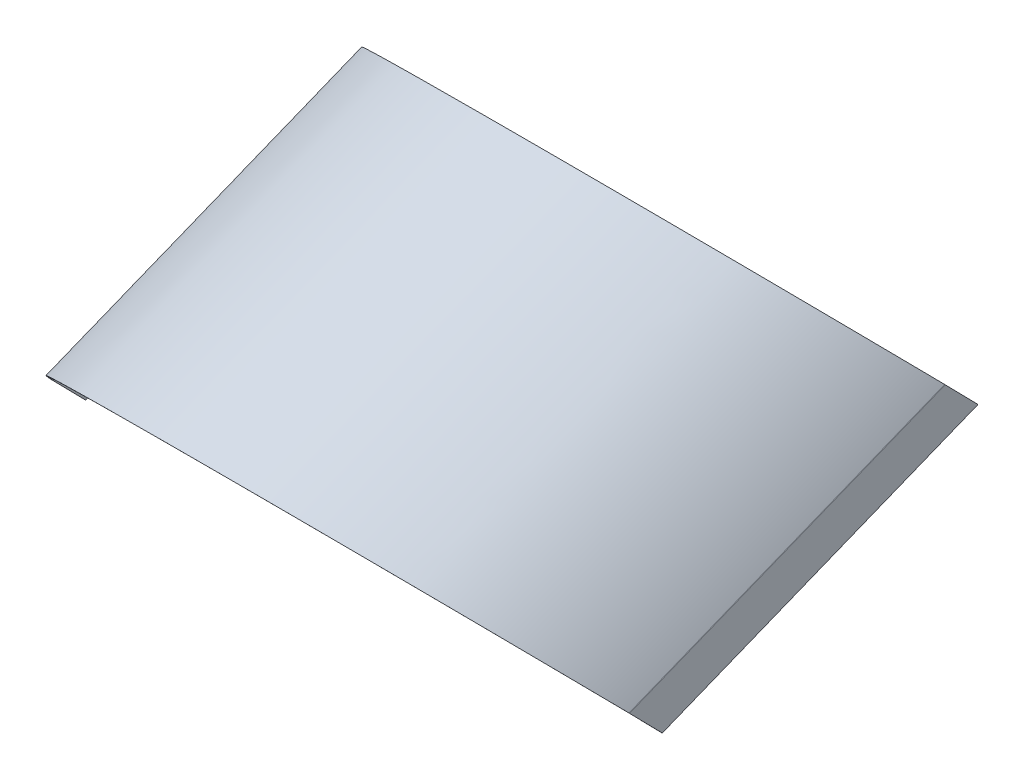
ISO-10303-21;
HEADER;
FILE_DESCRIPTION(('STEP AP214'),'2;1');
FILE_NAME('part.step','',(''),(''),'','','');
FILE_SCHEMA(('AUTOMOTIVE_DESIGN { 1 0 10303 214 1 1 1 1 }'));
ENDSEC;
DATA;
#1=APPLICATION_CONTEXT('core data for automotive mechanical design processes');
#2=APPLICATION_PROTOCOL_DEFINITION('international standard','automotive_design',2000,#1);
#3=PRODUCT_CONTEXT('',#1,'mechanical');
#4=PRODUCT('Part','Part','',(#3));
#5=PRODUCT_RELATED_PRODUCT_CATEGORY('part','',(#4));
#6=PRODUCT_DEFINITION_FORMATION('','',#4);
#7=PRODUCT_DEFINITION_CONTEXT('part definition',#1,'design');
#8=PRODUCT_DEFINITION('design','',#6,#7);
#9=PRODUCT_DEFINITION_SHAPE('','',#8);
#10=(LENGTH_UNIT() NAMED_UNIT(*) SI_UNIT(.MILLI.,.METRE.));
#11=(NAMED_UNIT(*) PLANE_ANGLE_UNIT() SI_UNIT($,.RADIAN.));
#12=(NAMED_UNIT(*) SI_UNIT($,.STERADIAN.) SOLID_ANGLE_UNIT());
#13=UNCERTAINTY_MEASURE_WITH_UNIT(LENGTH_MEASURE(1.E-05),#10,'distance_accuracy_value','');
#14=(GEOMETRIC_REPRESENTATION_CONTEXT(3) GLOBAL_UNCERTAINTY_ASSIGNED_CONTEXT((#13)) GLOBAL_UNIT_ASSIGNED_CONTEXT((#10,
#11,#12)) REPRESENTATION_CONTEXT('',''));
#15=CARTESIAN_POINT('',(0.,0.,0.));
#16=DIRECTION('',(0.,0.,1.));
#17=DIRECTION('',(1.,0.,0.));
#18=AXIS2_PLACEMENT_3D('',#15,#16,#17);
#19=CARTESIAN_POINT('',(158.177395808715,297.631991495394,466.725084626971));
#20=CARTESIAN_POINT('',(159.204825808715,297.631991495394,466.725084626971));
#21=CARTESIAN_POINT('',(159.204825808715,296.771188909988,465.881805086605));
#22=CARTESIAN_POINT('',(158.177395808715,296.771188909988,465.881805086605));
#23=CARTESIAN_POINT('',(157.149965808715,296.771188909988,465.881805086605));
#24=CARTESIAN_POINT('',(157.149965808715,297.631991495394,466.725084626971));
#25=CARTESIAN_POINT('',(158.177395808715,297.631991495394,466.725084626971));
#26=(BOUNDED_CURVE() B_SPLINE_CURVE(3,(#19,#20,#21,#22,#23,#24,#25),.UNSPECIFIED.,.T.,
.F.) B_SPLINE_CURVE_WITH_KNOTS((4,3,4),(0.,0.5,1.),
.UNSPECIFIED.) CURVE() GEOMETRIC_REPRESENTATION_ITEM() RATIONAL_B_SPLINE_CURVE((1.,
0.333333333333333,0.333333333333333,1.,0.333333333333333,0.333333333333333,1.)) REPRESENTATION_ITEM(''));
#27=DIRECTION('',(0.,0.372400072894438,-0.92807229551809));
#28=VECTOR('',#27,1.);
#29=SURFACE_OF_LINEAR_EXTRUSION('',#26,#28);
#30=CARTESIAN_POINT('',(158.691110808715,297.201590202691,466.303444856788));
#31=CARTESIAN_POINT('',(158.691110808715,297.278396914404,466.378688042216));
#32=CARTESIAN_POINT('',(158.667140500511,297.352531594915,466.451313590009));
#33=CARTESIAN_POINT('',(158.620867691773,297.418836096584,466.516268355061));
#34=(BOUNDED_CURVE() B_SPLINE_CURVE(3,(#30,#31,#32,#33),.UNSPECIFIED.,.F.,
.F.) B_SPLINE_CURVE_WITH_KNOTS((4,4),(0.,1.),
.UNSPECIFIED.) CURVE() GEOMETRIC_REPRESENTATION_ITEM() RATIONAL_B_SPLINE_CURVE((1.,
0.976807311567749,0.976807311567749,1.)) REPRESENTATION_ITEM(''));
#35=CARTESIAN_POINT('',(158.691110808715,297.201590202691,466.303444856788));
#36=VERTEX_POINT('',#35);
#37=CARTESIAN_POINT('',(158.620867691772,297.418836096583,466.516268355061));
#38=VERTEX_POINT('',#37);
#39=EDGE_CURVE('E76',#36,#38,#34,.T.);
#40=ORIENTED_EDGE('',*,*,#39,.F.);
#41=DIRECTION('',(0.,-0.372400072894438,0.92807229551809));
#42=VECTOR('',#41,1.);
#43=CARTESIAN_POINT('',(158.691110808715,297.201590202691,466.303444856788));
#44=LINE('',#43,#42);
#45=CARTESIAN_POINT('',(158.691110808715,349.012685162788,337.183057045927));
#46=VERTEX_POINT('',#45);
#47=EDGE_CURVE('E213',#46,#36,#44,.T.);
#48=ORIENTED_EDGE('',*,*,#47,.F.);
#49=CARTESIAN_POINT('',(158.620867691773,349.22993105668,337.395880544199));
#50=CARTESIAN_POINT('',(158.667140500511,349.163626555012,337.330925779147));
#51=CARTESIAN_POINT('',(158.691110808715,349.089491874501,337.258300231354));
#52=CARTESIAN_POINT('',(158.691110808715,349.012685162788,337.183057045926));
#53=(BOUNDED_CURVE() B_SPLINE_CURVE(3,(#49,#50,#51,#52),.UNSPECIFIED.,.F.,
.F.) B_SPLINE_CURVE_WITH_KNOTS((4,4),(0.,1.),
.UNSPECIFIED.) CURVE() GEOMETRIC_REPRESENTATION_ITEM() RATIONAL_B_SPLINE_CURVE((1.,
0.976807311567725,0.976807311567725,1.)) REPRESENTATION_ITEM(''));
#54=CARTESIAN_POINT('',(158.620867691772,349.22993105668,337.395880544199));
#55=VERTEX_POINT('',#54);
#56=EDGE_CURVE('E397',#55,#46,#53,.T.);
#57=ORIENTED_EDGE('',*,*,#56,.F.);
#58=DIRECTION('',(0.,0.372400072894438,-0.92807229551809));
#59=VECTOR('',#58,1.);
#60=CARTESIAN_POINT('',(158.620867691772,297.418836096583,466.516268355061));
#61=LINE('',#60,#59);
#62=EDGE_CURVE('E344',#38,#55,#61,.T.);
#63=ORIENTED_EDGE('',*,*,#62,.F.);
#64=EDGE_LOOP('',(#40,#48,#57,#63));
#65=FACE_BOUND('',#64,.T.);
#66=ADVANCED_FACE('F50',(#65),#29,.T.);
#67=CARTESIAN_POINT('',(157.663680808715,297.515279073689,466.610748077571));
#68=CARTESIAN_POINT('',(158.691110808715,297.515279073689,466.610748077571));
#69=CARTESIAN_POINT('',(158.691110808715,296.654476488284,465.767468537205));
#70=CARTESIAN_POINT('',(157.663680808715,296.654476488284,465.767468537205));
#71=CARTESIAN_POINT('',(156.636250808715,296.654476488284,465.767468537205));
#72=CARTESIAN_POINT('',(156.636250808715,297.515279073689,466.610748077571));
#73=CARTESIAN_POINT('',(157.663680808715,297.515279073689,466.610748077571));
#74=(BOUNDED_CURVE() B_SPLINE_CURVE(3,(#67,#68,#69,#70,#71,#72,#73),.UNSPECIFIED.,.T.,
.F.) B_SPLINE_CURVE_WITH_KNOTS((4,3,4),(0.,0.5,1.),
.UNSPECIFIED.) CURVE() GEOMETRIC_REPRESENTATION_ITEM() RATIONAL_B_SPLINE_CURVE((1.,
0.333333333333333,0.333333333333333,1.,0.333333333333333,0.333333333333333,1.)) REPRESENTATION_ITEM(''));
#75=DIRECTION('',(0.,0.372400072894438,-0.92807229551809));
#76=VECTOR('',#75,1.);
#77=SURFACE_OF_LINEAR_EXTRUSION('',#74,#76);
#78=CARTESIAN_POINT('',(158.106886893353,297.302504091341,466.402304478123));
#79=CARTESIAN_POINT('',(158.153332596331,297.236108002739,466.33725999054));
#80=CARTESIAN_POINT('',(158.177395808715,297.16183671237,466.264500613805));
#81=CARTESIAN_POINT('',(158.177395808715,297.084877780987,466.189108307388));
#82=(BOUNDED_CURVE() B_SPLINE_CURVE(3,(#78,#79,#80,#81),.UNSPECIFIED.,.F.,
.F.) B_SPLINE_CURVE_WITH_KNOTS((4,4),(0.,1.),
.UNSPECIFIED.) CURVE() GEOMETRIC_REPRESENTATION_ITEM() RATIONAL_B_SPLINE_CURVE((1.,
0.976717963163168,0.976717963163168,1.)) REPRESENTATION_ITEM(''));
#83=CARTESIAN_POINT('',(158.106886893353,297.302504091341,466.402304478123));
#84=VERTEX_POINT('',#83);
#85=CARTESIAN_POINT('',(158.177395808715,297.084877780987,466.189108307388));
#86=VERTEX_POINT('',#85);
#87=EDGE_CURVE('E188',#84,#86,#82,.T.);
#88=ORIENTED_EDGE('',*,*,#87,.F.);
#89=DIRECTION('',(0.,-0.372400072894438,0.92807229551809));
#90=VECTOR('',#89,1.);
#91=CARTESIAN_POINT('',(158.106886893353,297.302504091341,466.402304478123));
#92=LINE('',#91,#90);
#93=CARTESIAN_POINT('',(158.106886893353,349.113599051438,337.281916667262));
#94=VERTEX_POINT('',#93);
#95=EDGE_CURVE('E192',#94,#84,#92,.T.);
#96=ORIENTED_EDGE('',*,*,#95,.F.);
#97=CARTESIAN_POINT('',(158.177395808715,348.895972741084,337.068720496527));
#98=CARTESIAN_POINT('',(158.177395808715,348.972931672467,337.144112802944));
#99=CARTESIAN_POINT('',(158.153332596331,349.047202962836,337.216872179678));
#100=CARTESIAN_POINT('',(158.106886893353,349.113599051438,337.281916667262));
#101=(BOUNDED_CURVE() B_SPLINE_CURVE(3,(#97,#98,#99,#100),.UNSPECIFIED.,.F.,
.F.) B_SPLINE_CURVE_WITH_KNOTS((4,4),(0.,1.),
.UNSPECIFIED.) CURVE() GEOMETRIC_REPRESENTATION_ITEM() RATIONAL_B_SPLINE_CURVE((1.,
0.976717963163175,0.976717963163175,1.)) REPRESENTATION_ITEM(''));
#102=CARTESIAN_POINT('',(158.177395808715,348.895972741084,337.068720496527));
#103=VERTEX_POINT('',#102);
#104=EDGE_CURVE('E63',#103,#94,#101,.T.);
#105=ORIENTED_EDGE('',*,*,#104,.F.);
#106=DIRECTION('',(0.,0.372400072894438,-0.92807229551809));
#107=VECTOR('',#106,1.);
#108=CARTESIAN_POINT('',(158.177395808715,297.084877780987,466.189108307388));
#109=LINE('',#108,#107);
#110=EDGE_CURVE('E191',#86,#103,#109,.T.);
#111=ORIENTED_EDGE('',*,*,#110,.F.);
#112=EDGE_LOOP('',(#88,#96,#105,#111));
#113=FACE_BOUND('',#112,.T.);
#114=ADVANCED_FACE('F261',(#113),#77,.F.);
#115=CARTESIAN_POINT('',(-76.5903591912846,297.515279073689,466.610748077571));
#116=CARTESIAN_POINT('',(-75.5629291912846,297.515279073689,466.610748077571));
#117=CARTESIAN_POINT('',(-75.5629291912846,296.654476488284,465.767468537205));
#118=CARTESIAN_POINT('',(-76.5903591912846,296.654476488284,465.767468537205));
#119=CARTESIAN_POINT('',(-77.6177891912846,296.654476488284,465.767468537205));
#120=CARTESIAN_POINT('',(-77.6177891912846,297.515279073689,466.610748077571));
#121=CARTESIAN_POINT('',(-76.5903591912846,297.515279073689,466.610748077571));
#122=(BOUNDED_CURVE() B_SPLINE_CURVE(3,(#115,#116,#117,#118,#119,#120,#121),.UNSPECIFIED.,.T.,
.F.) B_SPLINE_CURVE_WITH_KNOTS((4,3,4),(0.,0.5,1.),
.UNSPECIFIED.) CURVE() GEOMETRIC_REPRESENTATION_ITEM() RATIONAL_B_SPLINE_CURVE((1.,
0.333333333333333,0.333333333333333,1.,0.333333333333333,0.333333333333333,1.)) REPRESENTATION_ITEM(''));
#123=DIRECTION('',(0.,0.372400072894438,-0.92807229551809));
#124=VECTOR('',#123,1.);
#125=SURFACE_OF_LINEAR_EXTRUSION('',#122,#124);
#126=CARTESIAN_POINT('',(-77.1040741912847,297.084877780987,466.189108307388));
#127=CARTESIAN_POINT('',(-77.1040741912847,297.16183671237,466.264500613805));
#128=CARTESIAN_POINT('',(-77.0800109789,297.236108002739,466.33725999054));
#129=CARTESIAN_POINT('',(-77.0335652759221,297.302504091341,466.402304478123));
#130=(BOUNDED_CURVE() B_SPLINE_CURVE(3,(#126,#127,#128,#129),.UNSPECIFIED.,.F.,
.F.) B_SPLINE_CURVE_WITH_KNOTS((4,4),(0.,1.),
.UNSPECIFIED.) CURVE() GEOMETRIC_REPRESENTATION_ITEM() RATIONAL_B_SPLINE_CURVE((1.,
0.976717963163193,0.976717963163193,1.)) REPRESENTATION_ITEM(''));
#131=CARTESIAN_POINT('',(-77.1040741912847,297.084877780987,466.189108307388));
#132=VERTEX_POINT('',#131);
#133=CARTESIAN_POINT('',(-77.0335652759221,297.302504091341,466.402304478123));
#134=VERTEX_POINT('',#133);
#135=EDGE_CURVE('E334',#132,#134,#130,.T.);
#136=ORIENTED_EDGE('',*,*,#135,.F.);
#137=DIRECTION('',(0.,-0.372400072894438,0.92807229551809));
#138=VECTOR('',#137,1.);
#139=CARTESIAN_POINT('',(-77.1040741912847,297.084877780987,466.189108307388));
#140=LINE('',#139,#138);
#141=CARTESIAN_POINT('',(-77.1040741912847,348.895972741084,337.068720496527));
#142=VERTEX_POINT('',#141);
#143=EDGE_CURVE('E214',#142,#132,#140,.T.);
#144=ORIENTED_EDGE('',*,*,#143,.F.);
#145=CARTESIAN_POINT('',(-77.0335652759221,349.113599051438,337.281916667262));
#146=CARTESIAN_POINT('',(-77.0800109789,349.047202962836,337.216872179678));
#147=CARTESIAN_POINT('',(-77.1040741912847,348.972931672467,337.144112802944));
#148=CARTESIAN_POINT('',(-77.1040741912847,348.895972741084,337.068720496527));
#149=(BOUNDED_CURVE() B_SPLINE_CURVE(3,(#145,#146,#147,#148),.UNSPECIFIED.,.F.,
.F.) B_SPLINE_CURVE_WITH_KNOTS((4,4),(0.,1.),
.UNSPECIFIED.) CURVE() GEOMETRIC_REPRESENTATION_ITEM() RATIONAL_B_SPLINE_CURVE((1.,
0.976717963163193,0.976717963163193,1.)) REPRESENTATION_ITEM(''));
#150=CARTESIAN_POINT('',(-77.0335652759221,349.113599051438,337.281916667262));
#151=VERTEX_POINT('',#150);
#152=EDGE_CURVE('E11',#151,#142,#149,.T.);
#153=ORIENTED_EDGE('',*,*,#152,.F.);
#154=DIRECTION('',(0.,0.372400072894438,-0.92807229551809));
#155=VECTOR('',#154,1.);
#156=CARTESIAN_POINT('',(-77.0335652759221,297.302504091341,466.402304478123));
#157=LINE('',#156,#155);
#158=EDGE_CURVE('E220',#134,#151,#157,.T.);
#159=ORIENTED_EDGE('',*,*,#158,.F.);
#160=EDGE_LOOP('',(#136,#144,#153,#159));
#161=FACE_BOUND('',#160,.T.);
#162=ADVANCED_FACE('F265',(#161),#125,.F.);
#163=CARTESIAN_POINT('',(-77.1040741912846,297.631991495394,466.725084626971));
#164=CARTESIAN_POINT('',(-76.0766441912846,297.631991495394,466.725084626971));
#165=CARTESIAN_POINT('',(-76.0766441912846,296.771188909988,465.881805086605));
#166=CARTESIAN_POINT('',(-77.1040741912846,296.771188909988,465.881805086605));
#167=CARTESIAN_POINT('',(-78.1315041912846,296.771188909988,465.881805086605));
#168=CARTESIAN_POINT('',(-78.1315041912846,297.631991495394,466.725084626971));
#169=CARTESIAN_POINT('',(-77.1040741912846,297.631991495394,466.725084626971));
#170=(BOUNDED_CURVE() B_SPLINE_CURVE(3,(#163,#164,#165,#166,#167,#168,#169),.UNSPECIFIED.,.T.,
.F.) B_SPLINE_CURVE_WITH_KNOTS((4,3,4),(0.,0.5,1.),
.UNSPECIFIED.) CURVE() GEOMETRIC_REPRESENTATION_ITEM() RATIONAL_B_SPLINE_CURVE((1.,
0.333333333333333,0.333333333333333,1.,0.333333333333333,0.333333333333333,1.)) REPRESENTATION_ITEM(''));
#171=DIRECTION('',(0.,0.372400072894438,-0.92807229551809));
#172=VECTOR('',#171,1.);
#173=SURFACE_OF_LINEAR_EXTRUSION('',#170,#172);
#174=CARTESIAN_POINT('',(-77.5475460743419,297.418836096584,466.516268355061));
#175=CARTESIAN_POINT('',(-77.5938188830805,297.352531594915,466.451313590009));
#176=CARTESIAN_POINT('',(-77.6177891912846,297.278396914404,466.378688042216));
#177=CARTESIAN_POINT('',(-77.6177891912846,297.201590202691,466.303444856788));
#178=(BOUNDED_CURVE() B_SPLINE_CURVE(3,(#174,#175,#176,#177),.UNSPECIFIED.,.F.,
.F.) B_SPLINE_CURVE_WITH_KNOTS((4,4),(0.,1.),
.UNSPECIFIED.) CURVE() GEOMETRIC_REPRESENTATION_ITEM() RATIONAL_B_SPLINE_CURVE((1.,
0.976807311567771,0.976807311567771,1.)) REPRESENTATION_ITEM(''));
#179=CARTESIAN_POINT('',(-77.5475460743419,297.418836096584,466.516268355061));
#180=VERTEX_POINT('',#179);
#181=CARTESIAN_POINT('',(-77.6177891912846,297.201590202691,466.303444856788));
#182=VERTEX_POINT('',#181);
#183=EDGE_CURVE('E345',#180,#182,#178,.T.);
#184=ORIENTED_EDGE('',*,*,#183,.F.);
#185=DIRECTION('',(0.,-0.372400072894438,0.92807229551809));
#186=VECTOR('',#185,1.);
#187=CARTESIAN_POINT('',(-77.5475460743419,297.418836096584,466.516268355061));
#188=LINE('',#187,#186);
#189=CARTESIAN_POINT('',(-77.5475460743419,349.22993105668,337.395880544199));
#190=VERTEX_POINT('',#189);
#191=EDGE_CURVE('E240',#190,#180,#188,.T.);
#192=ORIENTED_EDGE('',*,*,#191,.F.);
#193=CARTESIAN_POINT('',(-77.6177891912846,349.012685162788,337.183057045927));
#194=CARTESIAN_POINT('',(-77.6177891912846,349.089491874501,337.258300231354));
#195=CARTESIAN_POINT('',(-77.5938188830805,349.163626555012,337.330925779147));
#196=CARTESIAN_POINT('',(-77.5475460743418,349.22993105668,337.395880544199));
#197=(BOUNDED_CURVE() B_SPLINE_CURVE(3,(#193,#194,#195,#196),.UNSPECIFIED.,.F.,
.F.) B_SPLINE_CURVE_WITH_KNOTS((4,4),(0.,1.),
.UNSPECIFIED.) CURVE() GEOMETRIC_REPRESENTATION_ITEM() RATIONAL_B_SPLINE_CURVE((1.,
0.976807311567763,0.976807311567763,1.)) REPRESENTATION_ITEM(''));
#198=CARTESIAN_POINT('',(-77.6177891912846,349.012685162788,337.183057045927));
#199=VERTEX_POINT('',#198);
#200=EDGE_CURVE('E422',#199,#190,#197,.T.);
#201=ORIENTED_EDGE('',*,*,#200,.F.);
#202=DIRECTION('',(0.,0.372400072894438,-0.92807229551809));
#203=VECTOR('',#202,1.);
#204=CARTESIAN_POINT('',(-77.6177891912846,297.201590202691,466.303444856788));
#205=LINE('',#204,#203);
#206=EDGE_CURVE('E235',#182,#199,#205,.T.);
#207=ORIENTED_EDGE('',*,*,#206,.F.);
#208=EDGE_LOOP('',(#184,#192,#201,#207));
#209=FACE_BOUND('',#208,.T.);
#210=ADVANCED_FACE('F269',(#209),#173,.T.);
#211=CARTESIAN_POINT('',(-77.6177891912846,335.35632032602,323.804689859455));
#212=DIRECTION('',(0.,-0.699798617936555,0.714340181100075));
#213=DIRECTION('',(1.,0.,0.));
#214=AXIS2_PLACEMENT_3D('',#211,#212,#213);
#215=PLANE('',#214);
#216=DIRECTION('',(0.,0.714340181100075,0.699798617936555));
#217=VECTOR('',#216,1.);
#218=CARTESIAN_POINT('',(-77.6177891912846,335.35632032602,323.804689859455));
#219=LINE('',#218,#217);
#220=CARTESIAN_POINT('',(-77.6177891912846,335.35632032602,323.804689859455));
#221=VERTEX_POINT('',#220);
#222=EDGE_CURVE('E234',#221,#199,#219,.T.);
#223=ORIENTED_EDGE('',*,*,#222,.T.);
#224=ORIENTED_EDGE('',*,*,#200,.T.);
#225=CARTESIAN_POINT('',(-77.547546074342,349.22993105668,337.395880544199));
#226=CARTESIAN_POINT('',(-18.2262041475099,434.231730644311,420.667329424394));
#227=CARTESIAN_POINT('',(99.2995257649405,434.231730644311,420.667329424394));
#228=CARTESIAN_POINT('',(158.620867691773,349.229931056681,337.395880544199));
#229=(BOUNDED_CURVE() B_SPLINE_CURVE(3,(#225,#226,#227,#228),.UNSPECIFIED.,.F.,
.F.) B_SPLINE_CURVE_WITH_KNOTS((4,4),(0.,1.),
.UNSPECIFIED.) CURVE() GEOMETRIC_REPRESENTATION_ITEM() RATIONAL_B_SPLINE_CURVE((1.,
0.66983463661403,0.66983463661403,1.)) REPRESENTATION_ITEM(''));
#230=EDGE_CURVE('E212',#190,#55,#229,.T.);
#231=ORIENTED_EDGE('',*,*,#230,.T.);
#232=ORIENTED_EDGE('',*,*,#56,.T.);
#233=DIRECTION('',(0.,0.714340181100075,0.699798617936555));
#234=VECTOR('',#233,1.);
#235=CARTESIAN_POINT('',(158.691110808715,335.35632032602,323.804689859455));
#236=LINE('',#235,#234);
#237=CARTESIAN_POINT('',(158.691110808715,335.35632032602,323.804689859455));
#238=VERTEX_POINT('',#237);
#239=EDGE_CURVE('E174',#238,#46,#236,.T.);
#240=ORIENTED_EDGE('',*,*,#239,.F.);
#241=DIRECTION('',(1.,0.,0.));
#242=VECTOR('',#241,1.);
#243=CARTESIAN_POINT('',(-77.6177891912846,335.35632032602,323.804689859455));
#244=LINE('',#243,#242);
#245=CARTESIAN_POINT('',(158.177395808715,335.35632032602,323.804689859455));
#246=VERTEX_POINT('',#245);
#247=EDGE_CURVE('E184',#246,#238,#244,.T.);
#248=ORIENTED_EDGE('',*,*,#247,.F.);
#249=DIRECTION('',(0.,0.714340181100075,0.699798617936555));
#250=VECTOR('',#249,1.);
#251=CARTESIAN_POINT('',(158.177395808715,335.35632032602,323.804689859455));
#252=LINE('',#251,#250);
#253=EDGE_CURVE('E182',#246,#103,#252,.T.);
#254=ORIENTED_EDGE('',*,*,#253,.T.);
#255=ORIENTED_EDGE('',*,*,#104,.T.);
#256=CARTESIAN_POINT('',(-77.0335652759219,349.113599051438,337.281916667262));
#257=CARTESIAN_POINT('',(-17.9190066424308,433.620350398407,420.068394823713));
#258=CARTESIAN_POINT('',(98.9923282598613,433.620350398407,420.068394823713));
#259=CARTESIAN_POINT('',(158.106886893353,349.113599051438,337.281916667262));
#260=(BOUNDED_CURVE() B_SPLINE_CURVE(3,(#256,#257,#258,#259),.UNSPECIFIED.,.F.,
.F.) B_SPLINE_CURVE_WITH_KNOTS((4,4),(0.,1.),
.UNSPECIFIED.) CURVE() GEOMETRIC_REPRESENTATION_ITEM() RATIONAL_B_SPLINE_CURVE((1.,
0.670423879674261,0.670423879674261,1.)) REPRESENTATION_ITEM(''));
#261=EDGE_CURVE('E201',#151,#94,#260,.T.);
#262=ORIENTED_EDGE('',*,*,#261,.F.);
#263=ORIENTED_EDGE('',*,*,#152,.T.);
#264=DIRECTION('',(0.,0.714340181100075,0.699798617936555));
#265=VECTOR('',#264,1.);
#266=CARTESIAN_POINT('',(-77.1040741912847,335.35632032602,323.804689859455));
#267=LINE('',#266,#265);
#268=CARTESIAN_POINT('',(-77.1040741912847,335.35632032602,323.804689859455));
#269=VERTEX_POINT('',#268);
#270=EDGE_CURVE('E219',#269,#142,#267,.T.);
#271=ORIENTED_EDGE('',*,*,#270,.F.);
#272=DIRECTION('',(1.,0.,0.));
#273=VECTOR('',#272,1.);
#274=CARTESIAN_POINT('',(-77.6177891912846,335.35632032602,323.804689859455));
#275=LINE('',#274,#273);
#276=EDGE_CURVE('E229',#221,#269,#275,.T.);
#277=ORIENTED_EDGE('',*,*,#276,.F.);
#278=EDGE_LOOP('',(#223,#224,#231,#232,#240,#248,#254,#255,#262,#263,#271,#277));
#279=FACE_BOUND('',#278,.T.);
#280=ADVANCED_FACE('F412',(#279),#215,.F.);
#281=CARTESIAN_POINT('',(-77.6177891912846,283.545225365923,452.925077670317));
#282=DIRECTION('',(0.,-0.699798617936555,0.714340181100075));
#283=DIRECTION('',(1.,0.,0.));
#284=AXIS2_PLACEMENT_3D('',#281,#282,#283);
#285=PLANE('',#284);
#286=CARTESIAN_POINT('',(-77.547546074342,297.418836096584,466.516268355061));
#287=CARTESIAN_POINT('',(-18.2262041475099,382.420635684215,549.787717235256));
#288=CARTESIAN_POINT('',(99.2995257649405,382.420635684215,549.787717235256));
#289=CARTESIAN_POINT('',(158.620867691773,297.418836096584,466.516268355061));
#290=(BOUNDED_CURVE() B_SPLINE_CURVE(3,(#286,#287,#288,#289),.UNSPECIFIED.,.F.,
.F.) B_SPLINE_CURVE_WITH_KNOTS((4,4),(0.,1.),
.UNSPECIFIED.) CURVE() GEOMETRIC_REPRESENTATION_ITEM() RATIONAL_B_SPLINE_CURVE((1.,
0.66983463661403,0.66983463661403,1.)) REPRESENTATION_ITEM(''));
#291=EDGE_CURVE('E244',#180,#38,#290,.T.);
#292=ORIENTED_EDGE('',*,*,#291,.F.);
#293=ORIENTED_EDGE('',*,*,#183,.T.);
#294=DIRECTION('',(0.,0.714340181100075,0.699798617936555));
#295=VECTOR('',#294,1.);
#296=CARTESIAN_POINT('',(-77.6177891912846,283.545225365923,452.925077670317));
#297=LINE('',#296,#295);
#298=CARTESIAN_POINT('',(-77.6177891912846,283.545225365923,452.925077670317));
#299=VERTEX_POINT('',#298);
#300=EDGE_CURVE('E239',#299,#182,#297,.T.);
#301=ORIENTED_EDGE('',*,*,#300,.F.);
#302=DIRECTION('',(1.,0.,0.));
#303=VECTOR('',#302,1.);
#304=CARTESIAN_POINT('',(-77.6177891912846,283.545225365923,452.925077670317));
#305=LINE('',#304,#303);
#306=CARTESIAN_POINT('',(-77.1040741912847,283.545225365923,452.925077670317));
#307=VERTEX_POINT('',#306);
#308=EDGE_CURVE('E228',#299,#307,#305,.T.);
#309=ORIENTED_EDGE('',*,*,#308,.T.);
#310=DIRECTION('',(0.,0.714340181100075,0.699798617936555));
#311=VECTOR('',#310,1.);
#312=CARTESIAN_POINT('',(-77.1040741912847,283.545225365923,452.925077670317));
#313=LINE('',#312,#311);
#314=EDGE_CURVE('E218',#307,#132,#313,.T.);
#315=ORIENTED_EDGE('',*,*,#314,.T.);
#316=ORIENTED_EDGE('',*,*,#135,.T.);
#317=CARTESIAN_POINT('',(-77.0335652759219,297.302504091341,466.402304478123));
#318=CARTESIAN_POINT('',(-17.9190066424308,381.80925543831,549.188782634574));
#319=CARTESIAN_POINT('',(98.9923282598613,381.80925543831,549.188782634574));
#320=CARTESIAN_POINT('',(158.106886893353,297.302504091341,466.402304478123));
#321=(BOUNDED_CURVE() B_SPLINE_CURVE(3,(#317,#318,#319,#320),.UNSPECIFIED.,.F.,
.F.) B_SPLINE_CURVE_WITH_KNOTS((4,4),(0.,1.),
.UNSPECIFIED.) CURVE() GEOMETRIC_REPRESENTATION_ITEM() RATIONAL_B_SPLINE_CURVE((1.,
0.670423879674261,0.670423879674261,1.)) REPRESENTATION_ITEM(''));
#322=EDGE_CURVE('E204',#134,#84,#321,.T.);
#323=ORIENTED_EDGE('',*,*,#322,.T.);
#324=ORIENTED_EDGE('',*,*,#87,.T.);
#325=DIRECTION('',(0.,0.714340181100075,0.699798617936555));
#326=VECTOR('',#325,1.);
#327=CARTESIAN_POINT('',(158.177395808715,283.545225365923,452.925077670317));
#328=LINE('',#327,#326);
#329=CARTESIAN_POINT('',(158.177395808715,283.545225365923,452.925077670317));
#330=VERTEX_POINT('',#329);
#331=EDGE_CURVE('E180',#330,#86,#328,.T.);
#332=ORIENTED_EDGE('',*,*,#331,.F.);
#333=DIRECTION('',(1.,0.,0.));
#334=VECTOR('',#333,1.);
#335=CARTESIAN_POINT('',(-77.6177891912846,283.545225365923,452.925077670317));
#336=LINE('',#335,#334);
#337=CARTESIAN_POINT('',(158.691110808715,283.545225365923,452.925077670317));
#338=VERTEX_POINT('',#337);
#339=EDGE_CURVE('E164',#330,#338,#336,.T.);
#340=ORIENTED_EDGE('',*,*,#339,.T.);
#341=DIRECTION('',(0.,0.714340181100075,0.699798617936555));
#342=VECTOR('',#341,1.);
#343=CARTESIAN_POINT('',(158.691110808715,283.545225365923,452.925077670317));
#344=LINE('',#343,#342);
#345=EDGE_CURVE('E209',#338,#36,#344,.T.);
#346=ORIENTED_EDGE('',*,*,#345,.T.);
#347=ORIENTED_EDGE('',*,*,#39,.T.);
#348=EDGE_LOOP('',(#292,#293,#301,#309,#315,#316,#323,#324,#332,#340,#346,#347));
#349=FACE_BOUND('',#348,.T.);
#350=ADVANCED_FACE('F186',(#349),#285,.T.);
#351=CARTESIAN_POINT('',(40.5366608087153,354.176180074887,522.118223732399));
#352=CARTESIAN_POINT('',(314.112644570014,354.176180074887,522.118223732399));
#353=CARTESIAN_POINT('',(314.112644570014,124.968434411781,297.57637675358));
#354=CARTESIAN_POINT('',(40.5366608087154,124.968434411781,297.57637675358));
#355=CARTESIAN_POINT('',(-233.039322952583,124.968434411781,297.57637675358));
#356=CARTESIAN_POINT('',(-233.039322952583,354.176180074887,522.118223732399));
#357=CARTESIAN_POINT('',(40.5366608087153,354.176180074887,522.118223732399));
#358=(BOUNDED_CURVE() B_SPLINE_CURVE(3,(#351,#352,#353,#354,#355,#356,#357),.UNSPECIFIED.,.T.,
.F.) B_SPLINE_CURVE_WITH_KNOTS((4,3,4),(0.,0.5,1.),
.UNSPECIFIED.) CURVE() GEOMETRIC_REPRESENTATION_ITEM() RATIONAL_B_SPLINE_CURVE((1.,
0.333333333333333,0.333333333333333,1.,0.333333333333333,0.333333333333333,1.)) REPRESENTATION_ITEM(''));
#359=DIRECTION('',(0.,0.372400072894438,-0.92807229551809));
#360=VECTOR('',#359,1.);
#361=SURFACE_OF_LINEAR_EXTRUSION('',#358,#360);
#362=ORIENTED_EDGE('',*,*,#230,.F.);
#363=ORIENTED_EDGE('',*,*,#191,.T.);
#364=ORIENTED_EDGE('',*,*,#291,.T.);
#365=ORIENTED_EDGE('',*,*,#62,.T.);
#366=EDGE_LOOP('',(#362,#363,#364,#365));
#367=FACE_BOUND('',#366,.T.);
#368=ADVANCED_FACE('F292',(#367),#361,.T.);
#369=CARTESIAN_POINT('',(158.691110808715,283.545225365923,452.925077670317));
#370=DIRECTION('',(-1.,0.,0.));
#371=DIRECTION('',(0.,-0.372400072894438,0.92807229551809));
#372=AXIS2_PLACEMENT_3D('',#369,#370,#371);
#373=PLANE('',#372);
#374=ORIENTED_EDGE('',*,*,#239,.T.);
#375=ORIENTED_EDGE('',*,*,#47,.T.);
#376=ORIENTED_EDGE('',*,*,#345,.F.);
#377=DIRECTION('',(0.,0.372400072894438,-0.92807229551809));
#378=VECTOR('',#377,1.);
#379=CARTESIAN_POINT('',(158.691110808715,283.545225365923,452.925077670317));
#380=LINE('',#379,#378);
#381=EDGE_CURVE('E171',#338,#238,#380,.T.);
#382=ORIENTED_EDGE('',*,*,#381,.T.);
#383=EDGE_LOOP('',(#374,#375,#376,#382));
#384=FACE_BOUND('',#383,.T.);
#385=ADVANCED_FACE('F296',(#384),#373,.F.);
#386=CARTESIAN_POINT('',(-77.6177891912846,283.545225365923,452.925077670317));
#387=DIRECTION('',(0.,0.92807229551809,0.372400072894438));
#388=DIRECTION('',(1.,0.,0.));
#389=AXIS2_PLACEMENT_3D('',#386,#387,#388);
#390=PLANE('',#389);
#391=ORIENTED_EDGE('',*,*,#247,.T.);
#392=ORIENTED_EDGE('',*,*,#381,.F.);
#393=ORIENTED_EDGE('',*,*,#339,.F.);
#394=DIRECTION('',(0.,0.372400072894438,-0.92807229551809));
#395=VECTOR('',#394,1.);
#396=CARTESIAN_POINT('',(158.177395808715,283.545225365923,452.925077670317));
#397=LINE('',#396,#395);
#398=EDGE_CURVE('E168',#330,#246,#397,.T.);
#399=ORIENTED_EDGE('',*,*,#398,.T.);
#400=EDGE_LOOP('',(#391,#392,#393,#399));
#401=FACE_BOUND('',#400,.T.);
#402=ADVANCED_FACE('F167',(#401),#390,.F.);
#403=CARTESIAN_POINT('',(158.177395808715,283.545225365923,452.925077670317));
#404=DIRECTION('',(-1.,0.,0.));
#405=DIRECTION('',(0.,-0.372400072894438,0.92807229551809));
#406=AXIS2_PLACEMENT_3D('',#403,#404,#405);
#407=PLANE('',#406);
#408=ORIENTED_EDGE('',*,*,#331,.T.);
#409=ORIENTED_EDGE('',*,*,#110,.T.);
#410=ORIENTED_EDGE('',*,*,#253,.F.);
#411=ORIENTED_EDGE('',*,*,#398,.F.);
#412=EDGE_LOOP('',(#408,#409,#410,#411));
#413=FACE_BOUND('',#412,.T.);
#414=ADVANCED_FACE('F178',(#413),#407,.T.);
#415=CARTESIAN_POINT('',(40.5366608087153,353.745778782184,521.696583962216));
#416=CARTESIAN_POINT('',(313.085214570014,353.745778782184,521.696583962216));
#417=CARTESIAN_POINT('',(313.085214570014,125.398835704484,297.998016523763));
#418=CARTESIAN_POINT('',(40.5366608087154,125.398835704484,297.998016523763));
#419=CARTESIAN_POINT('',(-232.011892952583,125.398835704484,297.998016523763));
#420=CARTESIAN_POINT('',(-232.011892952583,353.745778782184,521.696583962216));
#421=CARTESIAN_POINT('',(40.5366608087153,353.745778782184,521.696583962216));
#422=(BOUNDED_CURVE() B_SPLINE_CURVE(3,(#415,#416,#417,#418,#419,#420,#421),.UNSPECIFIED.,.T.,
.F.) B_SPLINE_CURVE_WITH_KNOTS((4,3,4),(0.,0.5,1.),
.UNSPECIFIED.) CURVE() GEOMETRIC_REPRESENTATION_ITEM() RATIONAL_B_SPLINE_CURVE((1.,
0.333333333333333,0.333333333333333,1.,0.333333333333333,0.333333333333333,1.)) REPRESENTATION_ITEM(''));
#423=DIRECTION('',(0.,0.372400072894438,-0.92807229551809));
#424=VECTOR('',#423,1.);
#425=SURFACE_OF_LINEAR_EXTRUSION('',#422,#424);
#426=ORIENTED_EDGE('',*,*,#322,.F.);
#427=ORIENTED_EDGE('',*,*,#158,.T.);
#428=ORIENTED_EDGE('',*,*,#261,.T.);
#429=ORIENTED_EDGE('',*,*,#95,.T.);
#430=EDGE_LOOP('',(#426,#427,#428,#429));
#431=FACE_BOUND('',#430,.T.);
#432=ADVANCED_FACE('F305',(#431),#425,.F.);
#433=CARTESIAN_POINT('',(-77.1040741912847,283.545225365923,452.925077670317));
#434=DIRECTION('',(-1.,0.,0.));
#435=DIRECTION('',(0.,0.714340181100075,0.699798617936555));
#436=AXIS2_PLACEMENT_3D('',#433,#434,#435);
#437=PLANE('',#436);
#438=ORIENTED_EDGE('',*,*,#270,.T.);
#439=ORIENTED_EDGE('',*,*,#143,.T.);
#440=ORIENTED_EDGE('',*,*,#314,.F.);
#441=DIRECTION('',(0.,0.372400072894438,-0.92807229551809));
#442=VECTOR('',#441,1.);
#443=CARTESIAN_POINT('',(-77.1040741912847,283.545225365923,452.925077670317));
#444=LINE('',#443,#442);
#445=EDGE_CURVE('E224',#307,#269,#444,.T.);
#446=ORIENTED_EDGE('',*,*,#445,.T.);
#447=EDGE_LOOP('',(#438,#439,#440,#446));
#448=FACE_BOUND('',#447,.T.);
#449=ADVANCED_FACE('F308',(#448),#437,.F.);
#450=CARTESIAN_POINT('',(-77.6177891912846,283.545225365923,452.925077670317));
#451=DIRECTION('',(0.,0.92807229551809,0.372400072894438));
#452=DIRECTION('',(1.,0.,0.));
#453=AXIS2_PLACEMENT_3D('',#450,#451,#452);
#454=PLANE('',#453);
#455=ORIENTED_EDGE('',*,*,#276,.T.);
#456=ORIENTED_EDGE('',*,*,#445,.F.);
#457=ORIENTED_EDGE('',*,*,#308,.F.);
#458=DIRECTION('',(0.,0.372400072894438,-0.92807229551809));
#459=VECTOR('',#458,1.);
#460=CARTESIAN_POINT('',(-77.6177891912846,283.545225365923,452.925077670317));
#461=LINE('',#460,#459);
#462=EDGE_CURVE('E230',#299,#221,#461,.T.);
#463=ORIENTED_EDGE('',*,*,#462,.T.);
#464=EDGE_LOOP('',(#455,#456,#457,#463));
#465=FACE_BOUND('',#464,.T.);
#466=ADVANCED_FACE('F311',(#465),#454,.F.);
#467=CARTESIAN_POINT('',(-77.6177891912846,283.545225365923,452.925077670317));
#468=DIRECTION('',(-1.,0.,0.));
#469=DIRECTION('',(0.,-0.372400072894438,0.92807229551809));
#470=AXIS2_PLACEMENT_3D('',#467,#468,#469);
#471=PLANE('',#470);
#472=ORIENTED_EDGE('',*,*,#300,.T.);
#473=ORIENTED_EDGE('',*,*,#206,.T.);
#474=ORIENTED_EDGE('',*,*,#222,.F.);
#475=ORIENTED_EDGE('',*,*,#462,.F.);
#476=EDGE_LOOP('',(#472,#473,#474,#475));
#477=FACE_BOUND('',#476,.T.);
#478=ADVANCED_FACE('F52',(#477),#471,.T.);
#479=CLOSED_SHELL('',(#66,#114,#162,#210,#280,#350,#368,#385,#402,#414,#432,#449,#466,#478));
#480=MANIFOLD_SOLID_BREP('B2',#479);
#481=ADVANCED_BREP_SHAPE_REPRESENTATION('',(#18,#480),#14);
#482=SHAPE_DEFINITION_REPRESENTATION(#9,#481);
ENDSEC;
END-ISO-10303-21;
